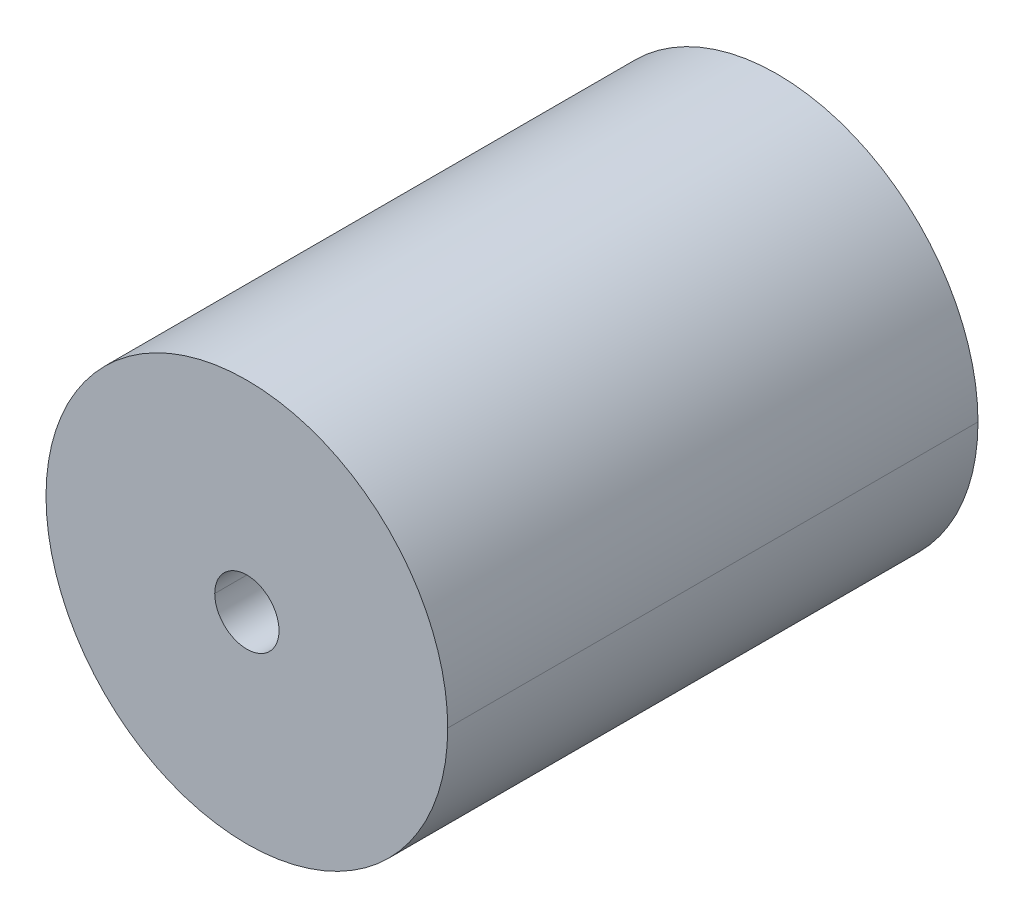
ISO-10303-21;
HEADER;
FILE_DESCRIPTION(('STEP AP214'),'2;1');
FILE_NAME('part.step','',(''),(''),'','','');
FILE_SCHEMA(('AUTOMOTIVE_DESIGN { 1 0 10303 214 1 1 1 1 }'));
ENDSEC;
DATA;
#1=APPLICATION_CONTEXT('core data for automotive mechanical design processes');
#2=APPLICATION_PROTOCOL_DEFINITION('international standard','automotive_design',2000,#1);
#3=PRODUCT_CONTEXT('',#1,'mechanical');
#4=PRODUCT('Part','Part','',(#3));
#5=PRODUCT_RELATED_PRODUCT_CATEGORY('part','',(#4));
#6=PRODUCT_DEFINITION_FORMATION('','',#4);
#7=PRODUCT_DEFINITION_CONTEXT('part definition',#1,'design');
#8=PRODUCT_DEFINITION('design','',#6,#7);
#9=PRODUCT_DEFINITION_SHAPE('','',#8);
#10=(LENGTH_UNIT() NAMED_UNIT(*) SI_UNIT(.MILLI.,.METRE.));
#11=(NAMED_UNIT(*) PLANE_ANGLE_UNIT() SI_UNIT($,.RADIAN.));
#12=(NAMED_UNIT(*) SI_UNIT($,.STERADIAN.) SOLID_ANGLE_UNIT());
#13=UNCERTAINTY_MEASURE_WITH_UNIT(LENGTH_MEASURE(1.E-05),#10,'distance_accuracy_value','');
#14=(GEOMETRIC_REPRESENTATION_CONTEXT(3) GLOBAL_UNCERTAINTY_ASSIGNED_CONTEXT((#13)) GLOBAL_UNIT_ASSIGNED_CONTEXT((#10,
#11,#12)) REPRESENTATION_CONTEXT('',''));
#15=CARTESIAN_POINT('',(0.,0.,0.));
#16=DIRECTION('',(0.,0.,1.));
#17=DIRECTION('',(1.,0.,0.));
#18=AXIS2_PLACEMENT_3D('',#15,#16,#17);
#19=CARTESIAN_POINT('',(0.,0.,66.));
#20=DIRECTION('',(0.,0.,-1.));
#21=DIRECTION('',(-1.,0.,0.));
#22=AXIS2_PLACEMENT_3D('',#19,#20,#21);
#23=CYLINDRICAL_SURFACE('',#22,4.);
#24=DIRECTION('',(0.,0.,-1.));
#25=VECTOR('',#24,1.);
#26=CARTESIAN_POINT('',(4.,0.,66.));
#27=LINE('',#26,#25);
#28=CARTESIAN_POINT('',(4.,0.,66.));
#29=VERTEX_POINT('',#28);
#30=CARTESIAN_POINT('',(4.,0.,0.));
#31=VERTEX_POINT('',#30);
#32=EDGE_CURVE('E72',#29,#31,#27,.T.);
#33=ORIENTED_EDGE('',*,*,#32,.F.);
#34=CARTESIAN_POINT('',(0.,0.,66.));
#35=DIRECTION('',(0.,0.,1.));
#36=DIRECTION('',(1.,0.,0.));
#37=AXIS2_PLACEMENT_3D('',#34,#35,#36);
#38=CIRCLE('',#37,4.);
#39=CARTESIAN_POINT('',(-4.,0.,66.));
#40=VERTEX_POINT('',#39);
#41=EDGE_CURVE('E67',#29,#40,#38,.T.);
#42=ORIENTED_EDGE('',*,*,#41,.T.);
#43=DIRECTION('',(0.,0.,-1.));
#44=VECTOR('',#43,1.);
#45=CARTESIAN_POINT('',(-4.,0.,66.));
#46=LINE('',#45,#44);
#47=CARTESIAN_POINT('',(-4.,0.,0.));
#48=VERTEX_POINT('',#47);
#49=EDGE_CURVE('E21',#40,#48,#46,.T.);
#50=ORIENTED_EDGE('',*,*,#49,.T.);
#51=CARTESIAN_POINT('',(0.,0.,0.));
#52=DIRECTION('',(0.,0.,1.));
#53=DIRECTION('',(1.,0.,0.));
#54=AXIS2_PLACEMENT_3D('',#51,#52,#53);
#55=CIRCLE('',#54,4.);
#56=EDGE_CURVE('E11',#31,#48,#55,.T.);
#57=ORIENTED_EDGE('',*,*,#56,.F.);
#58=EDGE_LOOP('',(#33,#42,#50,#57));
#59=FACE_BOUND('',#58,.T.);
#60=ADVANCED_FACE('F17',(#59),#23,.F.);
#61=CARTESIAN_POINT('',(0.,0.,66.));
#62=DIRECTION('',(0.,0.,-1.));
#63=DIRECTION('',(-1.,0.,0.));
#64=AXIS2_PLACEMENT_3D('',#61,#62,#63);
#65=CYLINDRICAL_SURFACE('',#64,25.);
#66=DIRECTION('',(0.,0.,-1.));
#67=VECTOR('',#66,1.);
#68=CARTESIAN_POINT('',(25.,0.,66.));
#69=LINE('',#68,#67);
#70=CARTESIAN_POINT('',(25.,0.,66.));
#71=VERTEX_POINT('',#70);
#72=CARTESIAN_POINT('',(25.,0.,0.));
#73=VERTEX_POINT('',#72);
#74=EDGE_CURVE('E106',#71,#73,#69,.T.);
#75=ORIENTED_EDGE('',*,*,#74,.F.);
#76=CARTESIAN_POINT('',(0.,0.,66.));
#77=DIRECTION('',(0.,0.,1.));
#78=DIRECTION('',(1.,0.,0.));
#79=AXIS2_PLACEMENT_3D('',#76,#77,#78);
#80=CIRCLE('',#79,25.);
#81=CARTESIAN_POINT('',(-25.,0.,66.));
#82=VERTEX_POINT('',#81);
#83=EDGE_CURVE('E77',#82,#71,#80,.T.);
#84=ORIENTED_EDGE('',*,*,#83,.F.);
#85=DIRECTION('',(0.,0.,-1.));
#86=VECTOR('',#85,1.);
#87=CARTESIAN_POINT('',(-25.,0.,66.));
#88=LINE('',#87,#86);
#89=CARTESIAN_POINT('',(-25.,0.,0.));
#90=VERTEX_POINT('',#89);
#91=EDGE_CURVE('E102',#82,#90,#88,.T.);
#92=ORIENTED_EDGE('',*,*,#91,.T.);
#93=CARTESIAN_POINT('',(0.,0.,0.));
#94=DIRECTION('',(0.,0.,1.));
#95=DIRECTION('',(1.,0.,0.));
#96=AXIS2_PLACEMENT_3D('',#93,#94,#95);
#97=CIRCLE('',#96,25.);
#98=EDGE_CURVE('E28',#90,#73,#97,.T.);
#99=ORIENTED_EDGE('',*,*,#98,.T.);
#100=EDGE_LOOP('',(#75,#84,#92,#99));
#101=FACE_BOUND('',#100,.T.);
#102=ADVANCED_FACE('F122',(#101),#65,.T.);
#103=CARTESIAN_POINT('',(0.,0.,0.));
#104=DIRECTION('',(0.,0.,1.));
#105=DIRECTION('',(1.,0.,0.));
#106=AXIS2_PLACEMENT_3D('',#103,#104,#105);
#107=PLANE('',#106);
#108=CARTESIAN_POINT('',(0.,0.,0.));
#109=DIRECTION('',(0.,0.,1.));
#110=DIRECTION('',(1.,0.,0.));
#111=AXIS2_PLACEMENT_3D('',#108,#109,#110);
#112=CIRCLE('',#111,4.);
#113=EDGE_CURVE('E83',#48,#31,#112,.T.);
#114=ORIENTED_EDGE('',*,*,#113,.T.);
#115=ORIENTED_EDGE('',*,*,#56,.T.);
#116=EDGE_LOOP('',(#114,#115));
#117=FACE_BOUND('',#116,.T.);
#118=ORIENTED_EDGE('',*,*,#98,.F.);
#119=CARTESIAN_POINT('',(0.,0.,0.));
#120=DIRECTION('',(0.,0.,1.));
#121=DIRECTION('',(1.,0.,0.));
#122=AXIS2_PLACEMENT_3D('',#119,#120,#121);
#123=CIRCLE('',#122,25.);
#124=EDGE_CURVE('E97',#73,#90,#123,.T.);
#125=ORIENTED_EDGE('',*,*,#124,.F.);
#126=EDGE_LOOP('',(#118,#125));
#127=FACE_BOUND('',#126,.T.);
#128=ADVANCED_FACE('F123',(#117,#127),#107,.F.);
#129=CARTESIAN_POINT('',(0.,0.,66.));
#130=DIRECTION('',(0.,0.,1.));
#131=DIRECTION('',(1.,0.,0.));
#132=AXIS2_PLACEMENT_3D('',#129,#130,#131);
#133=PLANE('',#132);
#134=CARTESIAN_POINT('',(0.,0.,66.));
#135=DIRECTION('',(0.,0.,1.));
#136=DIRECTION('',(1.,0.,0.));
#137=AXIS2_PLACEMENT_3D('',#134,#135,#136);
#138=CIRCLE('',#137,4.);
#139=EDGE_CURVE('E81',#40,#29,#138,.T.);
#140=ORIENTED_EDGE('',*,*,#139,.F.);
#141=ORIENTED_EDGE('',*,*,#41,.F.);
#142=EDGE_LOOP('',(#140,#141));
#143=FACE_BOUND('',#142,.T.);
#144=ORIENTED_EDGE('',*,*,#83,.T.);
#145=CARTESIAN_POINT('',(0.,0.,66.));
#146=DIRECTION('',(0.,0.,1.));
#147=DIRECTION('',(1.,0.,0.));
#148=AXIS2_PLACEMENT_3D('',#145,#146,#147);
#149=CIRCLE('',#148,25.);
#150=EDGE_CURVE('E85',#71,#82,#149,.T.);
#151=ORIENTED_EDGE('',*,*,#150,.T.);
#152=EDGE_LOOP('',(#144,#151));
#153=FACE_BOUND('',#152,.T.);
#154=ADVANCED_FACE('F19',(#143,#153),#133,.T.);
#155=CARTESIAN_POINT('',(0.,0.,66.));
#156=DIRECTION('',(0.,0.,-1.));
#157=DIRECTION('',(-1.,0.,0.));
#158=AXIS2_PLACEMENT_3D('',#155,#156,#157);
#159=CYLINDRICAL_SURFACE('',#158,25.);
#160=ORIENTED_EDGE('',*,*,#150,.F.);
#161=ORIENTED_EDGE('',*,*,#74,.T.);
#162=ORIENTED_EDGE('',*,*,#124,.T.);
#163=ORIENTED_EDGE('',*,*,#91,.F.);
#164=EDGE_LOOP('',(#160,#161,#162,#163));
#165=FACE_BOUND('',#164,.T.);
#166=ADVANCED_FACE('F120',(#165),#159,.T.);
#167=CARTESIAN_POINT('',(0.,0.,66.));
#168=DIRECTION('',(0.,0.,-1.));
#169=DIRECTION('',(-1.,0.,0.));
#170=AXIS2_PLACEMENT_3D('',#167,#168,#169);
#171=CYLINDRICAL_SURFACE('',#170,4.);
#172=ORIENTED_EDGE('',*,*,#139,.T.);
#173=ORIENTED_EDGE('',*,*,#32,.T.);
#174=ORIENTED_EDGE('',*,*,#113,.F.);
#175=ORIENTED_EDGE('',*,*,#49,.F.);
#176=EDGE_LOOP('',(#172,#173,#174,#175));
#177=FACE_BOUND('',#176,.T.);
#178=ADVANCED_FACE('F80',(#177),#171,.F.);
#179=CLOSED_SHELL('',(#60,#102,#128,#154,#166,#178));
#180=MANIFOLD_SOLID_BREP('B1',#179);
#181=ADVANCED_BREP_SHAPE_REPRESENTATION('',(#18,#180),#14);
#182=SHAPE_DEFINITION_REPRESENTATION(#9,#181);
ENDSEC;
END-ISO-10303-21;
